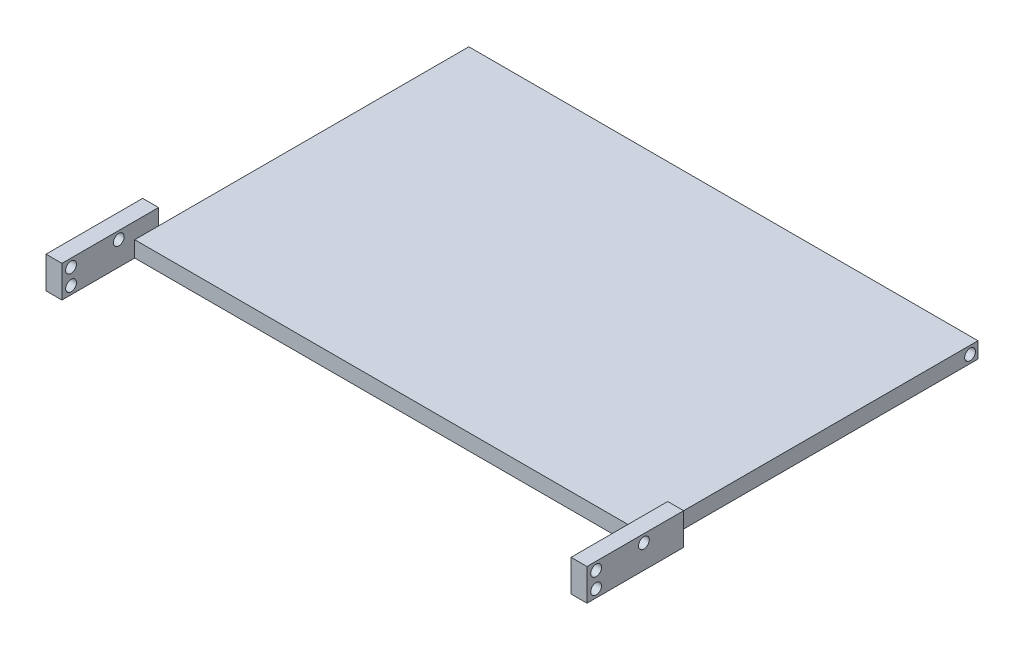
ISO-10303-21;
HEADER;
FILE_DESCRIPTION(('STEP AP214'),'2;1');
FILE_NAME('part.step','',(''),(''),'','','');
FILE_SCHEMA(('AUTOMOTIVE_DESIGN { 1 0 10303 214 1 1 1 1 }'));
ENDSEC;
DATA;
#1=APPLICATION_CONTEXT('core data for automotive mechanical design processes');
#2=APPLICATION_PROTOCOL_DEFINITION('international standard','automotive_design',2000,#1);
#3=PRODUCT_CONTEXT('',#1,'mechanical');
#4=PRODUCT('Part','Part','',(#3));
#5=PRODUCT_RELATED_PRODUCT_CATEGORY('part','',(#4));
#6=PRODUCT_DEFINITION_FORMATION('','',#4);
#7=PRODUCT_DEFINITION_CONTEXT('part definition',#1,'design');
#8=PRODUCT_DEFINITION('design','',#6,#7);
#9=PRODUCT_DEFINITION_SHAPE('','',#8);
#10=(LENGTH_UNIT() NAMED_UNIT(*) SI_UNIT(.MILLI.,.METRE.));
#11=(NAMED_UNIT(*) PLANE_ANGLE_UNIT() SI_UNIT($,.RADIAN.));
#12=(NAMED_UNIT(*) SI_UNIT($,.STERADIAN.) SOLID_ANGLE_UNIT());
#13=UNCERTAINTY_MEASURE_WITH_UNIT(LENGTH_MEASURE(1.E-05),#10,'distance_accuracy_value','');
#14=(GEOMETRIC_REPRESENTATION_CONTEXT(3) GLOBAL_UNCERTAINTY_ASSIGNED_CONTEXT((#13)) GLOBAL_UNIT_ASSIGNED_CONTEXT((#10,
#11,#12)) REPRESENTATION_CONTEXT('',''));
#15=CARTESIAN_POINT('',(0.,0.,0.));
#16=DIRECTION('',(0.,0.,1.));
#17=DIRECTION('',(1.,0.,0.));
#18=AXIS2_PLACEMENT_3D('',#15,#16,#17);
#19=CARTESIAN_POINT('',(80.,5.,-52.5));
#20=DIRECTION('',(-1.,0.,0.));
#21=DIRECTION('',(0.,0.,1.));
#22=AXIS2_PLACEMENT_3D('',#19,#20,#21);
#23=PLANE('',#22);
#24=CARTESIAN_POINT('',(80.,2.5,-50.));
#25=DIRECTION('',(-1.,0.,0.));
#26=DIRECTION('',(0.,0.,1.));
#27=AXIS2_PLACEMENT_3D('',#24,#25,#26);
#28=CIRCLE('',#27,1.7);
#29=CARTESIAN_POINT('',(80.,2.5,-48.3));
#30=VERTEX_POINT('',#29);
#31=EDGE_CURVE('E170',#30,#30,#28,.T.);
#32=ORIENTED_EDGE('',*,*,#31,.T.);
#33=EDGE_LOOP('',(#32));
#34=FACE_BOUND('',#33,.T.);
#35=DIRECTION('',(0.,1.,0.));
#36=VECTOR('',#35,1.);
#37=CARTESIAN_POINT('',(80.,0.,45.));
#38=LINE('',#37,#36);
#39=CARTESIAN_POINT('',(80.,0.,45.));
#40=VERTEX_POINT('',#39);
#41=CARTESIAN_POINT('',(80.,5.,45.));
#42=VERTEX_POINT('',#41);
#43=EDGE_CURVE('E66',#40,#42,#38,.T.);
#44=ORIENTED_EDGE('',*,*,#43,.F.);
#45=DIRECTION('',(0.,0.,-1.));
#46=VECTOR('',#45,1.);
#47=CARTESIAN_POINT('',(80.,0.,-52.5));
#48=LINE('',#47,#46);
#49=CARTESIAN_POINT('',(80.,0.,-52.5));
#50=VERTEX_POINT('',#49);
#51=EDGE_CURVE('E227',#40,#50,#48,.T.);
#52=ORIENTED_EDGE('',*,*,#51,.T.);
#53=DIRECTION('',(0.,-1.,0.));
#54=VECTOR('',#53,1.);
#55=CARTESIAN_POINT('',(80.,5.,-52.5));
#56=LINE('',#55,#54);
#57=CARTESIAN_POINT('',(80.,5.,-52.5));
#58=VERTEX_POINT('',#57);
#59=EDGE_CURVE('E11',#58,#50,#56,.T.);
#60=ORIENTED_EDGE('',*,*,#59,.F.);
#61=DIRECTION('',(0.,0.,-1.));
#62=VECTOR('',#61,1.);
#63=CARTESIAN_POINT('',(80.,5.,-52.5));
#64=LINE('',#63,#62);
#65=EDGE_CURVE('E242',#42,#58,#64,.T.);
#66=ORIENTED_EDGE('',*,*,#65,.F.);
#67=EDGE_LOOP('',(#44,#52,#60,#66));
#68=FACE_BOUND('',#67,.T.);
#69=ADVANCED_FACE('F42',(#34,#68),#23,.F.);
#70=CARTESIAN_POINT('',(-80.,5.,-52.5));
#71=DIRECTION('',(0.,0.,1.));
#72=DIRECTION('',(1.,0.,0.));
#73=AXIS2_PLACEMENT_3D('',#70,#71,#72);
#74=PLANE('',#73);
#75=DIRECTION('',(-1.,0.,0.));
#76=VECTOR('',#75,1.);
#77=CARTESIAN_POINT('',(-80.,0.,-52.5));
#78=LINE('',#77,#76);
#79=CARTESIAN_POINT('',(-80.,0.,-52.5));
#80=VERTEX_POINT('',#79);
#81=EDGE_CURVE('E256',#50,#80,#78,.T.);
#82=ORIENTED_EDGE('',*,*,#81,.T.);
#83=DIRECTION('',(0.,-1.,0.));
#84=VECTOR('',#83,1.);
#85=CARTESIAN_POINT('',(-80.,5.,-52.5));
#86=LINE('',#85,#84);
#87=CARTESIAN_POINT('',(-80.,5.,-52.5));
#88=VERTEX_POINT('',#87);
#89=EDGE_CURVE('E51',#88,#80,#86,.T.);
#90=ORIENTED_EDGE('',*,*,#89,.F.);
#91=DIRECTION('',(-1.,0.,0.));
#92=VECTOR('',#91,1.);
#93=CARTESIAN_POINT('',(-80.,5.,-52.5));
#94=LINE('',#93,#92);
#95=EDGE_CURVE('E241',#58,#88,#94,.T.);
#96=ORIENTED_EDGE('',*,*,#95,.F.);
#97=ORIENTED_EDGE('',*,*,#59,.T.);
#98=EDGE_LOOP('',(#82,#90,#96,#97));
#99=FACE_BOUND('',#98,.T.);
#100=ADVANCED_FACE('F291',(#99),#74,.F.);
#101=CARTESIAN_POINT('',(-80.,5.,-52.5));
#102=DIRECTION('',(1.,0.,0.));
#103=DIRECTION('',(0.,0.,-1.));
#104=AXIS2_PLACEMENT_3D('',#101,#102,#103);
#105=PLANE('',#104);
#106=CARTESIAN_POINT('',(-80.,2.5,-50.));
#107=DIRECTION('',(-1.,0.,0.));
#108=DIRECTION('',(0.,0.,1.));
#109=AXIS2_PLACEMENT_3D('',#106,#107,#108);
#110=CIRCLE('',#109,1.7);
#111=CARTESIAN_POINT('',(-80.,2.5,-48.3));
#112=VERTEX_POINT('',#111);
#113=EDGE_CURVE('E323',#112,#112,#110,.T.);
#114=ORIENTED_EDGE('',*,*,#113,.F.);
#115=EDGE_LOOP('',(#114));
#116=FACE_BOUND('',#115,.T.);
#117=DIRECTION('',(0.,0.,1.));
#118=VECTOR('',#117,1.);
#119=CARTESIAN_POINT('',(-80.,0.,-52.5));
#120=LINE('',#119,#118);
#121=CARTESIAN_POINT('',(-80.,0.,45.));
#122=VERTEX_POINT('',#121);
#123=EDGE_CURVE('E259',#80,#122,#120,.T.);
#124=ORIENTED_EDGE('',*,*,#123,.T.);
#125=DIRECTION('',(0.,1.,0.));
#126=VECTOR('',#125,1.);
#127=CARTESIAN_POINT('',(-80.,0.,45.));
#128=LINE('',#127,#126);
#129=CARTESIAN_POINT('',(-80.,5.,45.));
#130=VERTEX_POINT('',#129);
#131=EDGE_CURVE('E177',#122,#130,#128,.T.);
#132=ORIENTED_EDGE('',*,*,#131,.T.);
#133=DIRECTION('',(0.,0.,1.));
#134=VECTOR('',#133,1.);
#135=CARTESIAN_POINT('',(-80.,5.,-52.5));
#136=LINE('',#135,#134);
#137=EDGE_CURVE('E246',#88,#130,#136,.T.);
#138=ORIENTED_EDGE('',*,*,#137,.F.);
#139=ORIENTED_EDGE('',*,*,#89,.T.);
#140=EDGE_LOOP('',(#124,#132,#138,#139));
#141=FACE_BOUND('',#140,.T.);
#142=ADVANCED_FACE('F279',(#116,#141),#105,.F.);
#143=CARTESIAN_POINT('',(-80.,5.,52.5));
#144=DIRECTION('',(0.,0.,-1.));
#145=DIRECTION('',(-1.,0.,0.));
#146=AXIS2_PLACEMENT_3D('',#143,#144,#145);
#147=PLANE('',#146);
#148=DIRECTION('',(1.,0.,0.));
#149=VECTOR('',#148,1.);
#150=CARTESIAN_POINT('',(-80.,0.,52.5));
#151=LINE('',#150,#149);
#152=CARTESIAN_POINT('',(-80.,0.,52.5));
#153=VERTEX_POINT('',#152);
#154=CARTESIAN_POINT('',(80.,0.,52.5));
#155=VERTEX_POINT('',#154);
#156=EDGE_CURVE('E263',#153,#155,#151,.T.);
#157=ORIENTED_EDGE('',*,*,#156,.T.);
#158=DIRECTION('',(0.,-1.,0.));
#159=VECTOR('',#158,1.);
#160=CARTESIAN_POINT('',(80.,5.,52.5));
#161=LINE('',#160,#159);
#162=CARTESIAN_POINT('',(80.,5.,52.5));
#163=VERTEX_POINT('',#162);
#164=EDGE_CURVE('E253',#163,#155,#161,.T.);
#165=ORIENTED_EDGE('',*,*,#164,.F.);
#166=DIRECTION('',(1.,0.,0.));
#167=VECTOR('',#166,1.);
#168=CARTESIAN_POINT('',(-80.,5.,52.5));
#169=LINE('',#168,#167);
#170=CARTESIAN_POINT('',(-80.,5.,52.5));
#171=VERTEX_POINT('',#170);
#172=EDGE_CURVE('E250',#171,#163,#169,.T.);
#173=ORIENTED_EDGE('',*,*,#172,.F.);
#174=DIRECTION('',(0.,-1.,0.));
#175=VECTOR('',#174,1.);
#176=CARTESIAN_POINT('',(-80.,5.,52.5));
#177=LINE('',#176,#175);
#178=EDGE_CURVE('E269',#171,#153,#177,.T.);
#179=ORIENTED_EDGE('',*,*,#178,.T.);
#180=EDGE_LOOP('',(#157,#165,#173,#179));
#181=FACE_BOUND('',#180,.T.);
#182=ADVANCED_FACE('F314',(#181),#147,.F.);
#183=CARTESIAN_POINT('',(0.,5.,0.));
#184=DIRECTION('',(0.,1.,0.));
#185=DIRECTION('',(0.,0.,1.));
#186=AXIS2_PLACEMENT_3D('',#183,#184,#185);
#187=PLANE('',#186);
#188=EDGE_CURVE('E238',#163,#42,#64,.T.);
#189=ORIENTED_EDGE('',*,*,#188,.T.);
#190=ORIENTED_EDGE('',*,*,#65,.T.);
#191=ORIENTED_EDGE('',*,*,#95,.T.);
#192=ORIENTED_EDGE('',*,*,#137,.T.);
#193=EDGE_CURVE('E245',#130,#171,#136,.T.);
#194=ORIENTED_EDGE('',*,*,#193,.T.);
#195=ORIENTED_EDGE('',*,*,#172,.T.);
#196=EDGE_LOOP('',(#189,#190,#191,#192,#194,#195));
#197=FACE_BOUND('',#196,.T.);
#198=ADVANCED_FACE('F288',(#197),#187,.T.);
#199=CARTESIAN_POINT('',(0.,0.,0.));
#200=DIRECTION('',(0.,1.,0.));
#201=DIRECTION('',(0.,0.,1.));
#202=AXIS2_PLACEMENT_3D('',#199,#200,#201);
#203=PLANE('',#202);
#204=ORIENTED_EDGE('',*,*,#51,.F.);
#205=DIRECTION('',(-1.,0.,0.));
#206=VECTOR('',#205,1.);
#207=CARTESIAN_POINT('',(85.,0.,45.));
#208=LINE('',#207,#206);
#209=CARTESIAN_POINT('',(85.,0.,45.));
#210=VERTEX_POINT('',#209);
#211=EDGE_CURVE('E223',#210,#40,#208,.T.);
#212=ORIENTED_EDGE('',*,*,#211,.F.);
#213=DIRECTION('',(0.,0.,1.));
#214=VECTOR('',#213,1.);
#215=CARTESIAN_POINT('',(85.,0.,45.));
#216=LINE('',#215,#214);
#217=CARTESIAN_POINT('',(85.,0.,75.377017424845));
#218=VERTEX_POINT('',#217);
#219=EDGE_CURVE('E195',#210,#218,#216,.T.);
#220=ORIENTED_EDGE('',*,*,#219,.T.);
#221=DIRECTION('',(-1.,0.,0.));
#222=VECTOR('',#221,1.);
#223=CARTESIAN_POINT('',(85.,0.,75.377017424845));
#224=LINE('',#223,#222);
#225=CARTESIAN_POINT('',(80.,0.,75.377017424845));
#226=VERTEX_POINT('',#225);
#227=EDGE_CURVE('E209',#218,#226,#224,.T.);
#228=ORIENTED_EDGE('',*,*,#227,.T.);
#229=DIRECTION('',(0.,0.,1.));
#230=VECTOR('',#229,1.);
#231=CARTESIAN_POINT('',(80.,0.,45.));
#232=LINE('',#231,#230);
#233=EDGE_CURVE('E188',#155,#226,#232,.T.);
#234=ORIENTED_EDGE('',*,*,#233,.F.);
#235=ORIENTED_EDGE('',*,*,#156,.F.);
#236=DIRECTION('',(0.,0.,1.));
#237=VECTOR('',#236,1.);
#238=CARTESIAN_POINT('',(-80.,0.,45.));
#239=LINE('',#238,#237);
#240=CARTESIAN_POINT('',(-80.,0.,75.377017424845));
#241=VERTEX_POINT('',#240);
#242=EDGE_CURVE('E164',#153,#241,#239,.T.);
#243=ORIENTED_EDGE('',*,*,#242,.T.);
#244=DIRECTION('',(1.,0.,0.));
#245=VECTOR('',#244,1.);
#246=CARTESIAN_POINT('',(-85.,0.,75.377017424845));
#247=LINE('',#246,#245);
#248=CARTESIAN_POINT('',(-85.,0.,75.377017424845));
#249=VERTEX_POINT('',#248);
#250=EDGE_CURVE('E189',#249,#241,#247,.T.);
#251=ORIENTED_EDGE('',*,*,#250,.F.);
#252=DIRECTION('',(0.,0.,1.));
#253=VECTOR('',#252,1.);
#254=CARTESIAN_POINT('',(-85.,0.,45.));
#255=LINE('',#254,#253);
#256=CARTESIAN_POINT('',(-85.,0.,45.));
#257=VERTEX_POINT('',#256);
#258=EDGE_CURVE('E149',#257,#249,#255,.T.);
#259=ORIENTED_EDGE('',*,*,#258,.F.);
#260=DIRECTION('',(1.,0.,0.));
#261=VECTOR('',#260,1.);
#262=CARTESIAN_POINT('',(-85.,0.,45.));
#263=LINE('',#262,#261);
#264=EDGE_CURVE('E161',#257,#122,#263,.T.);
#265=ORIENTED_EDGE('',*,*,#264,.T.);
#266=ORIENTED_EDGE('',*,*,#123,.F.);
#267=ORIENTED_EDGE('',*,*,#81,.F.);
#268=EDGE_LOOP('',(#204,#212,#220,#228,#234,#235,#243,#251,#259,#265,#266,#267));
#269=FACE_BOUND('',#268,.T.);
#270=ADVANCED_FACE('F284',(#269),#203,.F.);
#271=CARTESIAN_POINT('',(80.,0.,0.));
#272=DIRECTION('',(-1.,0.,0.));
#273=DIRECTION('',(0.,0.,1.));
#274=AXIS2_PLACEMENT_3D('',#271,#272,#273);
#275=PLANE('',#274);
#276=CARTESIAN_POINT('',(80.,2.5,72.5));
#277=DIRECTION('',(-1.,0.,0.));
#278=DIRECTION('',(0.,0.,1.));
#279=AXIS2_PLACEMENT_3D('',#276,#277,#278);
#280=CIRCLE('',#279,1.7);
#281=CARTESIAN_POINT('',(80.,2.5,74.2));
#282=VERTEX_POINT('',#281);
#283=EDGE_CURVE('E360',#282,#282,#280,.T.);
#284=ORIENTED_EDGE('',*,*,#283,.F.);
#285=EDGE_LOOP('',(#284));
#286=FACE_BOUND('',#285,.T.);
#287=CARTESIAN_POINT('',(80.,7.5,72.5));
#288=DIRECTION('',(-1.,0.,0.));
#289=DIRECTION('',(0.,0.,1.));
#290=AXIS2_PLACEMENT_3D('',#287,#288,#289);
#291=CIRCLE('',#290,1.7);
#292=CARTESIAN_POINT('',(80.,7.5,74.2));
#293=VERTEX_POINT('',#292);
#294=EDGE_CURVE('E328',#293,#293,#291,.T.);
#295=ORIENTED_EDGE('',*,*,#294,.F.);
#296=EDGE_LOOP('',(#295));
#297=FACE_BOUND('',#296,.T.);
#298=CARTESIAN_POINT('',(80.,7.5,57.5));
#299=DIRECTION('',(-1.,0.,0.));
#300=DIRECTION('',(0.,0.,1.));
#301=AXIS2_PLACEMENT_3D('',#298,#299,#300);
#302=CIRCLE('',#301,1.7);
#303=CARTESIAN_POINT('',(80.,7.5,59.2));
#304=VERTEX_POINT('',#303);
#305=EDGE_CURVE('E343',#304,#304,#302,.T.);
#306=ORIENTED_EDGE('',*,*,#305,.F.);
#307=EDGE_LOOP('',(#306));
#308=FACE_BOUND('',#307,.T.);
#309=ORIENTED_EDGE('',*,*,#188,.F.);
#310=ORIENTED_EDGE('',*,*,#164,.T.);
#311=ORIENTED_EDGE('',*,*,#233,.T.);
#312=DIRECTION('',(0.,1.,0.));
#313=VECTOR('',#312,1.);
#314=CARTESIAN_POINT('',(80.,0.,75.377017424845));
#315=LINE('',#314,#313);
#316=CARTESIAN_POINT('',(80.,10.,75.377017424845));
#317=VERTEX_POINT('',#316);
#318=EDGE_CURVE('E212',#226,#317,#315,.T.);
#319=ORIENTED_EDGE('',*,*,#318,.T.);
#320=DIRECTION('',(0.,0.,1.));
#321=VECTOR('',#320,1.);
#322=CARTESIAN_POINT('',(80.,10.,45.));
#323=LINE('',#322,#321);
#324=CARTESIAN_POINT('',(80.,10.,45.));
#325=VERTEX_POINT('',#324);
#326=EDGE_CURVE('E216',#325,#317,#323,.T.);
#327=ORIENTED_EDGE('',*,*,#326,.F.);
#328=EDGE_CURVE('E220',#42,#325,#38,.T.);
#329=ORIENTED_EDGE('',*,*,#328,.F.);
#330=EDGE_LOOP('',(#309,#310,#311,#319,#327,#329));
#331=FACE_BOUND('',#330,.T.);
#332=ADVANCED_FACE('F311',(#286,#297,#308,#331),#275,.T.);
#333=CARTESIAN_POINT('',(85.,0.,45.));
#334=DIRECTION('',(0.,0.,1.));
#335=DIRECTION('',(1.,0.,0.));
#336=AXIS2_PLACEMENT_3D('',#333,#334,#335);
#337=PLANE('',#336);
#338=ORIENTED_EDGE('',*,*,#43,.T.);
#339=ORIENTED_EDGE('',*,*,#328,.T.);
#340=DIRECTION('',(-1.,0.,0.));
#341=VECTOR('',#340,1.);
#342=CARTESIAN_POINT('',(85.,10.,45.));
#343=LINE('',#342,#341);
#344=CARTESIAN_POINT('',(85.,10.,45.));
#345=VERTEX_POINT('',#344);
#346=EDGE_CURVE('E228',#345,#325,#343,.T.);
#347=ORIENTED_EDGE('',*,*,#346,.F.);
#348=DIRECTION('',(0.,1.,0.));
#349=VECTOR('',#348,1.);
#350=CARTESIAN_POINT('',(85.,0.,45.));
#351=LINE('',#350,#349);
#352=EDGE_CURVE('E206',#210,#345,#351,.T.);
#353=ORIENTED_EDGE('',*,*,#352,.F.);
#354=ORIENTED_EDGE('',*,*,#211,.T.);
#355=EDGE_LOOP('',(#338,#339,#347,#353,#354));
#356=FACE_BOUND('',#355,.T.);
#357=ADVANCED_FACE('F295',(#356),#337,.F.);
#358=CARTESIAN_POINT('',(85.,10.,45.));
#359=DIRECTION('',(0.,-1.,0.));
#360=DIRECTION('',(0.,0.,-1.));
#361=AXIS2_PLACEMENT_3D('',#358,#359,#360);
#362=PLANE('',#361);
#363=ORIENTED_EDGE('',*,*,#326,.T.);
#364=DIRECTION('',(-1.,0.,0.));
#365=VECTOR('',#364,1.);
#366=CARTESIAN_POINT('',(85.,10.,75.377017424845));
#367=LINE('',#366,#365);
#368=CARTESIAN_POINT('',(85.,10.,75.377017424845));
#369=VERTEX_POINT('',#368);
#370=EDGE_CURVE('E232',#369,#317,#367,.T.);
#371=ORIENTED_EDGE('',*,*,#370,.F.);
#372=DIRECTION('',(0.,0.,1.));
#373=VECTOR('',#372,1.);
#374=CARTESIAN_POINT('',(85.,10.,45.));
#375=LINE('',#374,#373);
#376=EDGE_CURVE('E203',#345,#369,#375,.T.);
#377=ORIENTED_EDGE('',*,*,#376,.F.);
#378=ORIENTED_EDGE('',*,*,#346,.T.);
#379=EDGE_LOOP('',(#363,#371,#377,#378));
#380=FACE_BOUND('',#379,.T.);
#381=ADVANCED_FACE('F415',(#380),#362,.F.);
#382=CARTESIAN_POINT('',(85.,0.,75.377017424845));
#383=DIRECTION('',(0.,0.,1.));
#384=DIRECTION('',(1.,0.,0.));
#385=AXIS2_PLACEMENT_3D('',#382,#383,#384);
#386=PLANE('',#385);
#387=ORIENTED_EDGE('',*,*,#318,.F.);
#388=ORIENTED_EDGE('',*,*,#227,.F.);
#389=DIRECTION('',(0.,1.,0.));
#390=VECTOR('',#389,1.);
#391=CARTESIAN_POINT('',(85.,0.,75.377017424845));
#392=LINE('',#391,#390);
#393=EDGE_CURVE('E199',#218,#369,#392,.T.);
#394=ORIENTED_EDGE('',*,*,#393,.T.);
#395=ORIENTED_EDGE('',*,*,#370,.T.);
#396=EDGE_LOOP('',(#387,#388,#394,#395));
#397=FACE_BOUND('',#396,.T.);
#398=ADVANCED_FACE('F306',(#397),#386,.T.);
#399=CARTESIAN_POINT('',(85.,0.,0.));
#400=DIRECTION('',(-1.,0.,0.));
#401=DIRECTION('',(0.,0.,1.));
#402=AXIS2_PLACEMENT_3D('',#399,#400,#401);
#403=PLANE('',#402);
#404=CARTESIAN_POINT('',(85.,2.5,72.5));
#405=DIRECTION('',(1.,0.,0.));
#406=DIRECTION('',(0.,0.,-1.));
#407=AXIS2_PLACEMENT_3D('',#404,#405,#406);
#408=CIRCLE('',#407,1.7);
#409=CARTESIAN_POINT('',(85.,2.5,70.8));
#410=VERTEX_POINT('',#409);
#411=EDGE_CURVE('E371',#410,#410,#408,.T.);
#412=ORIENTED_EDGE('',*,*,#411,.F.);
#413=EDGE_LOOP('',(#412));
#414=FACE_BOUND('',#413,.T.);
#415=CARTESIAN_POINT('',(85.,7.5,72.5));
#416=DIRECTION('',(-1.,0.,0.));
#417=DIRECTION('',(0.,0.,1.));
#418=AXIS2_PLACEMENT_3D('',#415,#416,#417);
#419=CIRCLE('',#418,1.7);
#420=CARTESIAN_POINT('',(85.,7.5,74.2));
#421=VERTEX_POINT('',#420);
#422=EDGE_CURVE('E333',#421,#421,#419,.T.);
#423=ORIENTED_EDGE('',*,*,#422,.T.);
#424=EDGE_LOOP('',(#423));
#425=FACE_BOUND('',#424,.T.);
#426=CARTESIAN_POINT('',(85.,7.5,57.5));
#427=DIRECTION('',(-1.,0.,0.));
#428=DIRECTION('',(0.,0.,1.));
#429=AXIS2_PLACEMENT_3D('',#426,#427,#428);
#430=CIRCLE('',#429,1.7);
#431=CARTESIAN_POINT('',(85.,7.5,59.2));
#432=VERTEX_POINT('',#431);
#433=EDGE_CURVE('E347',#432,#432,#430,.T.);
#434=ORIENTED_EDGE('',*,*,#433,.T.);
#435=EDGE_LOOP('',(#434));
#436=FACE_BOUND('',#435,.T.);
#437=ORIENTED_EDGE('',*,*,#219,.F.);
#438=ORIENTED_EDGE('',*,*,#352,.T.);
#439=ORIENTED_EDGE('',*,*,#376,.T.);
#440=ORIENTED_EDGE('',*,*,#393,.F.);
#441=EDGE_LOOP('',(#437,#438,#439,#440));
#442=FACE_BOUND('',#441,.T.);
#443=ADVANCED_FACE('F301',(#414,#425,#436,#442),#403,.F.);
#444=CARTESIAN_POINT('',(-80.,0.,0.));
#445=DIRECTION('',(1.,0.,0.));
#446=DIRECTION('',(0.,0.,-1.));
#447=AXIS2_PLACEMENT_3D('',#444,#445,#446);
#448=PLANE('',#447);
#449=CARTESIAN_POINT('',(-80.,2.5,72.5));
#450=DIRECTION('',(1.,0.,0.));
#451=DIRECTION('',(0.,0.,-1.));
#452=AXIS2_PLACEMENT_3D('',#449,#450,#451);
#453=CIRCLE('',#452,1.7);
#454=CARTESIAN_POINT('',(-80.,2.5,70.8));
#455=VERTEX_POINT('',#454);
#456=EDGE_CURVE('E367',#455,#455,#453,.T.);
#457=ORIENTED_EDGE('',*,*,#456,.F.);
#458=EDGE_LOOP('',(#457));
#459=FACE_BOUND('',#458,.T.);
#460=CARTESIAN_POINT('',(-80.,7.5,72.5));
#461=DIRECTION('',(1.,0.,0.));
#462=DIRECTION('',(0.,0.,-1.));
#463=AXIS2_PLACEMENT_3D('',#460,#461,#462);
#464=CIRCLE('',#463,1.7);
#465=CARTESIAN_POINT('',(-80.,7.5,70.8));
#466=VERTEX_POINT('',#465);
#467=EDGE_CURVE('E339',#466,#466,#464,.T.);
#468=ORIENTED_EDGE('',*,*,#467,.F.);
#469=EDGE_LOOP('',(#468));
#470=FACE_BOUND('',#469,.T.);
#471=CARTESIAN_POINT('',(-80.,7.5,57.5));
#472=DIRECTION('',(1.,0.,0.));
#473=DIRECTION('',(0.,0.,-1.));
#474=AXIS2_PLACEMENT_3D('',#471,#472,#473);
#475=CIRCLE('',#474,1.7);
#476=CARTESIAN_POINT('',(-80.,7.5,55.8));
#477=VERTEX_POINT('',#476);
#478=EDGE_CURVE('E351',#477,#477,#475,.T.);
#479=ORIENTED_EDGE('',*,*,#478,.F.);
#480=EDGE_LOOP('',(#479));
#481=FACE_BOUND('',#480,.T.);
#482=ORIENTED_EDGE('',*,*,#178,.F.);
#483=ORIENTED_EDGE('',*,*,#193,.F.);
#484=CARTESIAN_POINT('',(-80.,10.,45.));
#485=VERTEX_POINT('',#484);
#486=EDGE_CURVE('E58',#130,#485,#128,.T.);
#487=ORIENTED_EDGE('',*,*,#486,.T.);
#488=DIRECTION('',(0.,0.,1.));
#489=VECTOR('',#488,1.);
#490=CARTESIAN_POINT('',(-80.,10.,45.));
#491=LINE('',#490,#489);
#492=CARTESIAN_POINT('',(-80.,10.,75.377017424845));
#493=VERTEX_POINT('',#492);
#494=EDGE_CURVE('E145',#485,#493,#491,.T.);
#495=ORIENTED_EDGE('',*,*,#494,.T.);
#496=DIRECTION('',(0.,1.,0.));
#497=VECTOR('',#496,1.);
#498=CARTESIAN_POINT('',(-80.,0.,75.377017424845));
#499=LINE('',#498,#497);
#500=EDGE_CURVE('E167',#241,#493,#499,.T.);
#501=ORIENTED_EDGE('',*,*,#500,.F.);
#502=ORIENTED_EDGE('',*,*,#242,.F.);
#503=EDGE_LOOP('',(#482,#483,#487,#495,#501,#502));
#504=FACE_BOUND('',#503,.T.);
#505=ADVANCED_FACE('F319',(#459,#470,#481,#504),#448,.T.);
#506=CARTESIAN_POINT('',(-85.,0.,45.));
#507=DIRECTION('',(0.,0.,-1.));
#508=DIRECTION('',(-1.,0.,0.));
#509=AXIS2_PLACEMENT_3D('',#506,#507,#508);
#510=PLANE('',#509);
#511=ORIENTED_EDGE('',*,*,#131,.F.);
#512=ORIENTED_EDGE('',*,*,#264,.F.);
#513=DIRECTION('',(0.,1.,0.));
#514=VECTOR('',#513,1.);
#515=CARTESIAN_POINT('',(-85.,0.,45.));
#516=LINE('',#515,#514);
#517=CARTESIAN_POINT('',(-85.,10.,45.));
#518=VERTEX_POINT('',#517);
#519=EDGE_CURVE('E154',#257,#518,#516,.T.);
#520=ORIENTED_EDGE('',*,*,#519,.T.);
#521=DIRECTION('',(1.,0.,0.));
#522=VECTOR('',#521,1.);
#523=CARTESIAN_POINT('',(-85.,10.,45.));
#524=LINE('',#523,#522);
#525=EDGE_CURVE('E140',#518,#485,#524,.T.);
#526=ORIENTED_EDGE('',*,*,#525,.T.);
#527=ORIENTED_EDGE('',*,*,#486,.F.);
#528=EDGE_LOOP('',(#511,#512,#520,#526,#527));
#529=FACE_BOUND('',#528,.T.);
#530=ADVANCED_FACE('F160',(#529),#510,.T.);
#531=CARTESIAN_POINT('',(-85.,0.,75.377017424845));
#532=DIRECTION('',(0.,0.,-1.));
#533=DIRECTION('',(-1.,0.,0.));
#534=AXIS2_PLACEMENT_3D('',#531,#532,#533);
#535=PLANE('',#534);
#536=ORIENTED_EDGE('',*,*,#500,.T.);
#537=DIRECTION('',(1.,0.,0.));
#538=VECTOR('',#537,1.);
#539=CARTESIAN_POINT('',(-85.,10.,75.377017424845));
#540=LINE('',#539,#538);
#541=CARTESIAN_POINT('',(-85.,10.,75.377017424845));
#542=VERTEX_POINT('',#541);
#543=EDGE_CURVE('E148',#542,#493,#540,.T.);
#544=ORIENTED_EDGE('',*,*,#543,.F.);
#545=DIRECTION('',(0.,1.,0.));
#546=VECTOR('',#545,1.);
#547=CARTESIAN_POINT('',(-85.,0.,75.377017424845));
#548=LINE('',#547,#546);
#549=EDGE_CURVE('E156',#249,#542,#548,.T.);
#550=ORIENTED_EDGE('',*,*,#549,.F.);
#551=ORIENTED_EDGE('',*,*,#250,.T.);
#552=EDGE_LOOP('',(#536,#544,#550,#551));
#553=FACE_BOUND('',#552,.T.);
#554=ADVANCED_FACE('F318',(#553),#535,.F.);
#555=CARTESIAN_POINT('',(-85.,10.,45.));
#556=DIRECTION('',(0.,1.,0.));
#557=DIRECTION('',(0.,0.,1.));
#558=AXIS2_PLACEMENT_3D('',#555,#556,#557);
#559=PLANE('',#558);
#560=ORIENTED_EDGE('',*,*,#494,.F.);
#561=ORIENTED_EDGE('',*,*,#525,.F.);
#562=DIRECTION('',(0.,0.,1.));
#563=VECTOR('',#562,1.);
#564=CARTESIAN_POINT('',(-85.,10.,45.));
#565=LINE('',#564,#563);
#566=EDGE_CURVE('E143',#518,#542,#565,.T.);
#567=ORIENTED_EDGE('',*,*,#566,.T.);
#568=ORIENTED_EDGE('',*,*,#543,.T.);
#569=EDGE_LOOP('',(#560,#561,#567,#568));
#570=FACE_BOUND('',#569,.T.);
#571=ADVANCED_FACE('F142',(#570),#559,.T.);
#572=CARTESIAN_POINT('',(-85.,0.,0.));
#573=DIRECTION('',(1.,0.,0.));
#574=DIRECTION('',(0.,0.,-1.));
#575=AXIS2_PLACEMENT_3D('',#572,#573,#574);
#576=PLANE('',#575);
#577=CARTESIAN_POINT('',(-85.,2.5,72.5));
#578=DIRECTION('',(1.,0.,0.));
#579=DIRECTION('',(0.,0.,-1.));
#580=AXIS2_PLACEMENT_3D('',#577,#578,#579);
#581=CIRCLE('',#580,1.7);
#582=CARTESIAN_POINT('',(-85.,2.5,70.8));
#583=VERTEX_POINT('',#582);
#584=EDGE_CURVE('E45',#583,#583,#581,.T.);
#585=ORIENTED_EDGE('',*,*,#584,.T.);
#586=EDGE_LOOP('',(#585));
#587=FACE_BOUND('',#586,.T.);
#588=CARTESIAN_POINT('',(-85.,7.5,72.5));
#589=DIRECTION('',(-1.,0.,0.));
#590=DIRECTION('',(0.,0.,1.));
#591=AXIS2_PLACEMENT_3D('',#588,#589,#590);
#592=CIRCLE('',#591,1.7);
#593=CARTESIAN_POINT('',(-85.,7.5,74.2));
#594=VERTEX_POINT('',#593);
#595=EDGE_CURVE('E355',#594,#594,#592,.T.);
#596=ORIENTED_EDGE('',*,*,#595,.F.);
#597=EDGE_LOOP('',(#596));
#598=FACE_BOUND('',#597,.T.);
#599=CARTESIAN_POINT('',(-85.,7.5,57.5));
#600=DIRECTION('',(-1.,0.,0.));
#601=DIRECTION('',(0.,0.,1.));
#602=AXIS2_PLACEMENT_3D('',#599,#600,#601);
#603=CIRCLE('',#602,1.7);
#604=CARTESIAN_POINT('',(-85.,7.5,59.2));
#605=VERTEX_POINT('',#604);
#606=EDGE_CURVE('E356',#605,#605,#603,.T.);
#607=ORIENTED_EDGE('',*,*,#606,.F.);
#608=EDGE_LOOP('',(#607));
#609=FACE_BOUND('',#608,.T.);
#610=ORIENTED_EDGE('',*,*,#519,.F.);
#611=ORIENTED_EDGE('',*,*,#258,.T.);
#612=ORIENTED_EDGE('',*,*,#549,.T.);
#613=ORIENTED_EDGE('',*,*,#566,.F.);
#614=EDGE_LOOP('',(#610,#611,#612,#613));
#615=FACE_BOUND('',#614,.T.);
#616=ADVANCED_FACE('F153',(#587,#598,#609,#615),#576,.F.);
#617=CARTESIAN_POINT('',(120.,2.5,-50.));
#618=DIRECTION('',(-1.,0.,0.));
#619=DIRECTION('',(0.,0.,1.));
#620=AXIS2_PLACEMENT_3D('',#617,#618,#619);
#621=CYLINDRICAL_SURFACE('',#620,1.7);
#622=ORIENTED_EDGE('',*,*,#113,.T.);
#623=EDGE_LOOP('',(#622));
#624=FACE_BOUND('',#623,.T.);
#625=ORIENTED_EDGE('',*,*,#31,.F.);
#626=EDGE_LOOP('',(#625));
#627=FACE_BOUND('',#626,.T.);
#628=ADVANCED_FACE('F438',(#624,#627),#621,.F.);
#629=CARTESIAN_POINT('',(115.,7.5,57.5));
#630=DIRECTION('',(-1.,0.,0.));
#631=DIRECTION('',(0.,0.,1.));
#632=AXIS2_PLACEMENT_3D('',#629,#630,#631);
#633=CYLINDRICAL_SURFACE('',#632,1.7);
#634=ORIENTED_EDGE('',*,*,#478,.T.);
#635=EDGE_LOOP('',(#634));
#636=FACE_BOUND('',#635,.T.);
#637=ORIENTED_EDGE('',*,*,#606,.T.);
#638=EDGE_LOOP('',(#637));
#639=FACE_BOUND('',#638,.T.);
#640=ADVANCED_FACE('F441',(#636,#639),#633,.F.);
#641=CARTESIAN_POINT('',(115.,7.5,72.5));
#642=DIRECTION('',(-1.,0.,0.));
#643=DIRECTION('',(0.,0.,1.));
#644=AXIS2_PLACEMENT_3D('',#641,#642,#643);
#645=CYLINDRICAL_SURFACE('',#644,1.7);
#646=ORIENTED_EDGE('',*,*,#467,.T.);
#647=EDGE_LOOP('',(#646));
#648=FACE_BOUND('',#647,.T.);
#649=ORIENTED_EDGE('',*,*,#595,.T.);
#650=EDGE_LOOP('',(#649));
#651=FACE_BOUND('',#650,.T.);
#652=ADVANCED_FACE('F396',(#648,#651),#645,.F.);
#653=ORIENTED_EDGE('',*,*,#305,.T.);
#654=EDGE_LOOP('',(#653));
#655=FACE_BOUND('',#654,.T.);
#656=ORIENTED_EDGE('',*,*,#433,.F.);
#657=EDGE_LOOP('',(#656));
#658=FACE_BOUND('',#657,.T.);
#659=ADVANCED_FACE('F393',(#655,#658),#633,.F.);
#660=ORIENTED_EDGE('',*,*,#294,.T.);
#661=EDGE_LOOP('',(#660));
#662=FACE_BOUND('',#661,.T.);
#663=ORIENTED_EDGE('',*,*,#422,.F.);
#664=EDGE_LOOP('',(#663));
#665=FACE_BOUND('',#664,.T.);
#666=ADVANCED_FACE('F385',(#662,#665),#645,.F.);
#667=CARTESIAN_POINT('',(-115.,2.5,72.5));
#668=DIRECTION('',(1.,0.,0.));
#669=DIRECTION('',(0.,0.,-1.));
#670=AXIS2_PLACEMENT_3D('',#667,#668,#669);
#671=CYLINDRICAL_SURFACE('',#670,1.7);
#672=ORIENTED_EDGE('',*,*,#456,.T.);
#673=EDGE_LOOP('',(#672));
#674=FACE_BOUND('',#673,.T.);
#675=ORIENTED_EDGE('',*,*,#584,.F.);
#676=EDGE_LOOP('',(#675));
#677=FACE_BOUND('',#676,.T.);
#678=ADVANCED_FACE('F382',(#674,#677),#671,.F.);
#679=ORIENTED_EDGE('',*,*,#283,.T.);
#680=EDGE_LOOP('',(#679));
#681=FACE_BOUND('',#680,.T.);
#682=ORIENTED_EDGE('',*,*,#411,.T.);
#683=EDGE_LOOP('',(#682));
#684=FACE_BOUND('',#683,.T.);
#685=ADVANCED_FACE('F384',(#681,#684),#671,.F.);
#686=CLOSED_SHELL('',(#69,#100,#142,#182,#198,#270,#332,#357,#381,#398,#443,#505,#530,#554,#571,
#616,#628,#640,#652,#659,#666,#678,#685));
#687=MANIFOLD_SOLID_BREP('B2',#686);
#688=ADVANCED_BREP_SHAPE_REPRESENTATION('',(#18,#687),#14);
#689=SHAPE_DEFINITION_REPRESENTATION(#9,#688);
ENDSEC;
END-ISO-10303-21;
